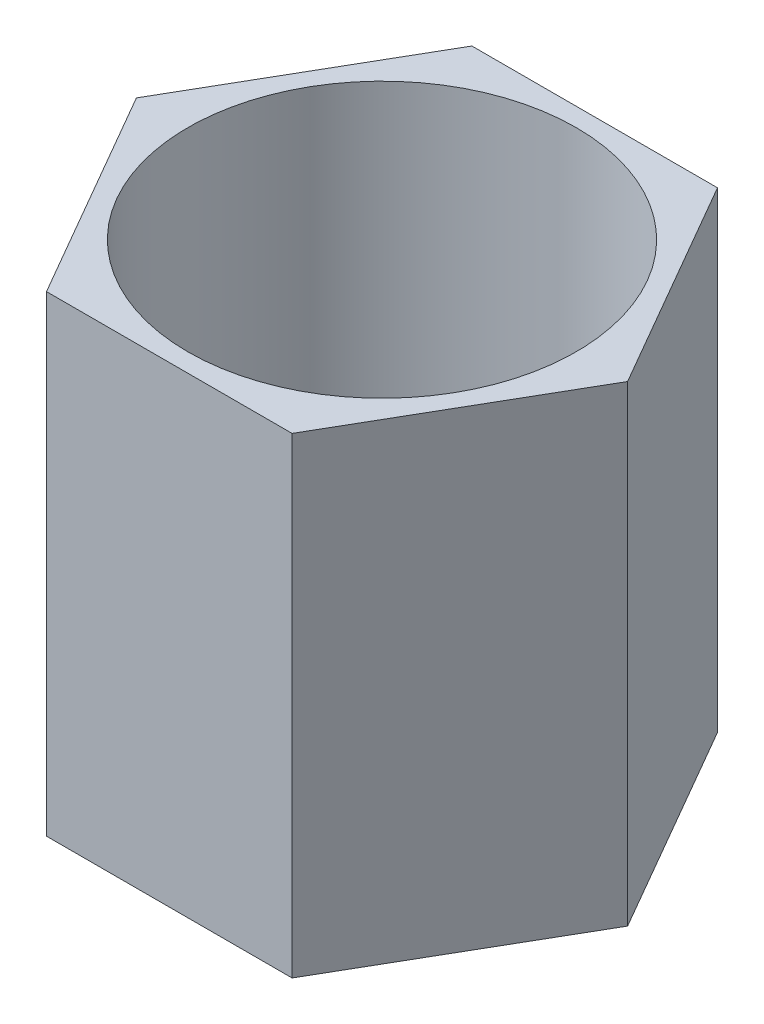
ISO-10303-21;
HEADER;
FILE_DESCRIPTION(('STEP AP214'),'2;1');
FILE_NAME('part.step','',(''),(''),'','','');
FILE_SCHEMA(('AUTOMOTIVE_DESIGN { 1 0 10303 214 1 1 1 1 }'));
ENDSEC;
DATA;
#1=APPLICATION_CONTEXT('core data for automotive mechanical design processes');
#2=APPLICATION_PROTOCOL_DEFINITION('international standard','automotive_design',2000,#1);
#3=PRODUCT_CONTEXT('',#1,'mechanical');
#4=PRODUCT('Part','Part','',(#3));
#5=PRODUCT_RELATED_PRODUCT_CATEGORY('part','',(#4));
#6=PRODUCT_DEFINITION_FORMATION('','',#4);
#7=PRODUCT_DEFINITION_CONTEXT('part definition',#1,'design');
#8=PRODUCT_DEFINITION('design','',#6,#7);
#9=PRODUCT_DEFINITION_SHAPE('','',#8);
#10=(LENGTH_UNIT() NAMED_UNIT(*) SI_UNIT(.MILLI.,.METRE.));
#11=(NAMED_UNIT(*) PLANE_ANGLE_UNIT() SI_UNIT($,.RADIAN.));
#12=(NAMED_UNIT(*) SI_UNIT($,.STERADIAN.) SOLID_ANGLE_UNIT());
#13=UNCERTAINTY_MEASURE_WITH_UNIT(LENGTH_MEASURE(1.E-05),#10,'distance_accuracy_value','');
#14=(GEOMETRIC_REPRESENTATION_CONTEXT(3) GLOBAL_UNCERTAINTY_ASSIGNED_CONTEXT((#13)) GLOBAL_UNIT_ASSIGNED_CONTEXT((#10,
#11,#12)) REPRESENTATION_CONTEXT('',''));
#15=CARTESIAN_POINT('',(0.,0.,0.));
#16=DIRECTION('',(0.,0.,1.));
#17=DIRECTION('',(1.,0.,0.));
#18=AXIS2_PLACEMENT_3D('',#15,#16,#17);
#19=CARTESIAN_POINT('',(0.,5.1,0.));
#20=DIRECTION('',(0.,1.,0.));
#21=DIRECTION('',(0.,0.,1.));
#22=AXIS2_PLACEMENT_3D('',#19,#20,#21);
#23=PLANE('',#22);
#24=CARTESIAN_POINT('',(0.,5.1,0.));
#25=DIRECTION('',(0.,1.,0.));
#26=DIRECTION('',(0.,0.,1.));
#27=AXIS2_PLACEMENT_3D('',#24,#25,#26);
#28=CIRCLE('',#27,2.1);
#29=CARTESIAN_POINT('',(0.,5.1,2.1));
#30=VERTEX_POINT('',#29);
#31=EDGE_CURVE('E162',#30,#30,#28,.T.);
#32=ORIENTED_EDGE('',*,*,#31,.F.);
#33=EDGE_LOOP('',(#32));
#34=FACE_BOUND('',#33,.T.);
#35=DIRECTION('',(0.5,0.,-0.866025403784439));
#36=VECTOR('',#35,1.);
#37=CARTESIAN_POINT('',(1.32790561913614,5.1,2.3));
#38=LINE('',#37,#36);
#39=CARTESIAN_POINT('',(1.32790561913614,5.1,2.3));
#40=VERTEX_POINT('',#39);
#41=CARTESIAN_POINT('',(2.65581123827228,5.1,0.));
#42=VERTEX_POINT('',#41);
#43=EDGE_CURVE('E146',#40,#42,#38,.T.);
#44=ORIENTED_EDGE('',*,*,#43,.T.);
#45=DIRECTION('',(-0.5,0.,-0.866025403784438));
#46=VECTOR('',#45,1.);
#47=CARTESIAN_POINT('',(2.65581123827228,5.1,0.));
#48=LINE('',#47,#46);
#49=CARTESIAN_POINT('',(1.32790561913614,5.1,-2.3));
#50=VERTEX_POINT('',#49);
#51=EDGE_CURVE('E140',#42,#50,#48,.T.);
#52=ORIENTED_EDGE('',*,*,#51,.T.);
#53=DIRECTION('',(-1.,0.,0.));
#54=VECTOR('',#53,1.);
#55=CARTESIAN_POINT('',(1.32790561913614,5.1,-2.3));
#56=LINE('',#55,#54);
#57=CARTESIAN_POINT('',(-1.32790561913614,5.1,-2.3));
#58=VERTEX_POINT('',#57);
#59=EDGE_CURVE('E135',#50,#58,#56,.T.);
#60=ORIENTED_EDGE('',*,*,#59,.T.);
#61=DIRECTION('',(-0.5,0.,0.866025403784439));
#62=VECTOR('',#61,1.);
#63=CARTESIAN_POINT('',(-1.32790561913614,5.1,-2.3));
#64=LINE('',#63,#62);
#65=CARTESIAN_POINT('',(-2.65581123827228,5.1,0.));
#66=VERTEX_POINT('',#65);
#67=EDGE_CURVE('E68',#58,#66,#64,.T.);
#68=ORIENTED_EDGE('',*,*,#67,.T.);
#69=DIRECTION('',(0.5,0.,0.866025403784439));
#70=VECTOR('',#69,1.);
#71=CARTESIAN_POINT('',(-2.65581123827228,5.1,0.));
#72=LINE('',#71,#70);
#73=CARTESIAN_POINT('',(-1.32790561913614,5.1,2.3));
#74=VERTEX_POINT('',#73);
#75=EDGE_CURVE('E123',#66,#74,#72,.T.);
#76=ORIENTED_EDGE('',*,*,#75,.T.);
#77=DIRECTION('',(1.,0.,0.));
#78=VECTOR('',#77,1.);
#79=CARTESIAN_POINT('',(-1.32790561913614,5.1,2.3));
#80=LINE('',#79,#78);
#81=EDGE_CURVE('E130',#74,#40,#80,.T.);
#82=ORIENTED_EDGE('',*,*,#81,.T.);
#83=EDGE_LOOP('',(#44,#52,#60,#68,#76,#82));
#84=FACE_BOUND('',#83,.T.);
#85=ADVANCED_FACE('F49',(#34,#84),#23,.T.);
#86=CARTESIAN_POINT('',(0.,0.,0.));
#87=DIRECTION('',(0.,1.,0.));
#88=DIRECTION('',(0.,0.,1.));
#89=AXIS2_PLACEMENT_3D('',#86,#87,#88);
#90=PLANE('',#89);
#91=CARTESIAN_POINT('',(0.,0.,0.));
#92=DIRECTION('',(0.,1.,0.));
#93=DIRECTION('',(0.,0.,1.));
#94=AXIS2_PLACEMENT_3D('',#91,#92,#93);
#95=CIRCLE('',#94,2.1);
#96=CARTESIAN_POINT('',(0.,0.,2.1));
#97=VERTEX_POINT('',#96);
#98=EDGE_CURVE('E152',#97,#97,#95,.T.);
#99=ORIENTED_EDGE('',*,*,#98,.T.);
#100=EDGE_LOOP('',(#99));
#101=FACE_BOUND('',#100,.T.);
#102=DIRECTION('',(-0.5,0.,-0.866025403784438));
#103=VECTOR('',#102,1.);
#104=CARTESIAN_POINT('',(1.99185842870421,0.,-1.15));
#105=LINE('',#104,#103);
#106=CARTESIAN_POINT('',(2.65581123827228,0.,0.));
#107=VERTEX_POINT('',#106);
#108=CARTESIAN_POINT('',(1.32790561913614,0.,-2.3));
#109=VERTEX_POINT('',#108);
#110=EDGE_CURVE('E11',#107,#109,#105,.T.);
#111=ORIENTED_EDGE('',*,*,#110,.F.);
#112=DIRECTION('',(0.5,0.,-0.866025403784439));
#113=VECTOR('',#112,1.);
#114=CARTESIAN_POINT('',(1.99185842870421,0.,1.15));
#115=LINE('',#114,#113);
#116=CARTESIAN_POINT('',(1.32790561913614,0.,2.3));
#117=VERTEX_POINT('',#116);
#118=EDGE_CURVE('E58',#117,#107,#115,.T.);
#119=ORIENTED_EDGE('',*,*,#118,.F.);
#120=DIRECTION('',(1.,0.,0.));
#121=VECTOR('',#120,1.);
#122=CARTESIAN_POINT('',(0.,0.,2.3));
#123=LINE('',#122,#121);
#124=CARTESIAN_POINT('',(-1.32790561913614,0.,2.3));
#125=VERTEX_POINT('',#124);
#126=EDGE_CURVE('E176',#125,#117,#123,.T.);
#127=ORIENTED_EDGE('',*,*,#126,.F.);
#128=DIRECTION('',(0.5,0.,0.866025403784439));
#129=VECTOR('',#128,1.);
#130=CARTESIAN_POINT('',(-1.99185842870421,0.,1.15));
#131=LINE('',#130,#129);
#132=CARTESIAN_POINT('',(-2.65581123827228,0.,0.));
#133=VERTEX_POINT('',#132);
#134=EDGE_CURVE('E174',#133,#125,#131,.T.);
#135=ORIENTED_EDGE('',*,*,#134,.F.);
#136=DIRECTION('',(-0.5,0.,0.866025403784439));
#137=VECTOR('',#136,1.);
#138=CARTESIAN_POINT('',(-1.99185842870421,0.,-1.15));
#139=LINE('',#138,#137);
#140=CARTESIAN_POINT('',(-1.32790561913614,0.,-2.3));
#141=VERTEX_POINT('',#140);
#142=EDGE_CURVE('E115',#141,#133,#139,.T.);
#143=ORIENTED_EDGE('',*,*,#142,.F.);
#144=DIRECTION('',(-1.,0.,0.));
#145=VECTOR('',#144,1.);
#146=CARTESIAN_POINT('',(0.,0.,-2.3));
#147=LINE('',#146,#145);
#148=EDGE_CURVE('E166',#109,#141,#147,.T.);
#149=ORIENTED_EDGE('',*,*,#148,.F.);
#150=EDGE_LOOP('',(#111,#119,#127,#135,#143,#149));
#151=FACE_BOUND('',#150,.T.);
#152=ADVANCED_FACE('F51',(#101,#151),#90,.F.);
#153=CARTESIAN_POINT('',(0.,5.1,0.));
#154=DIRECTION('',(0.,-1.,0.));
#155=DIRECTION('',(0.,0.,-1.));
#156=AXIS2_PLACEMENT_3D('',#153,#154,#155);
#157=CYLINDRICAL_SURFACE('',#156,2.1);
#158=ORIENTED_EDGE('',*,*,#31,.T.);
#159=EDGE_LOOP('',(#158));
#160=FACE_BOUND('',#159,.T.);
#161=ORIENTED_EDGE('',*,*,#98,.F.);
#162=EDGE_LOOP('',(#161));
#163=FACE_BOUND('',#162,.T.);
#164=ADVANCED_FACE('F208',(#160,#163),#157,.F.);
#165=CARTESIAN_POINT('',(2.65581123827228,-4.9,0.));
#166=DIRECTION('',(0.866025403784438,0.,-0.5));
#167=DIRECTION('',(-0.5,0.,-0.866025403784438));
#168=AXIS2_PLACEMENT_3D('',#165,#166,#167);
#169=PLANE('',#168);
#170=ORIENTED_EDGE('',*,*,#110,.T.);
#171=DIRECTION('',(0.,1.,0.));
#172=VECTOR('',#171,1.);
#173=CARTESIAN_POINT('',(1.32790561913614,-4.9,-2.3));
#174=LINE('',#173,#172);
#175=EDGE_CURVE('E77',#109,#50,#174,.T.);
#176=ORIENTED_EDGE('',*,*,#175,.T.);
#177=ORIENTED_EDGE('',*,*,#51,.F.);
#178=DIRECTION('',(0.,1.,0.));
#179=VECTOR('',#178,1.);
#180=CARTESIAN_POINT('',(2.65581123827228,-4.9,0.));
#181=LINE('',#180,#179);
#182=EDGE_CURVE('E149',#107,#42,#181,.T.);
#183=ORIENTED_EDGE('',*,*,#182,.F.);
#184=EDGE_LOOP('',(#170,#176,#177,#183));
#185=FACE_BOUND('',#184,.T.);
#186=ADVANCED_FACE('F189',(#185),#169,.T.);
#187=CARTESIAN_POINT('',(1.32790561913614,-4.9,2.3));
#188=DIRECTION('',(0.866025403784439,0.,0.5));
#189=DIRECTION('',(0.5,0.,-0.866025403784439));
#190=AXIS2_PLACEMENT_3D('',#187,#188,#189);
#191=PLANE('',#190);
#192=ORIENTED_EDGE('',*,*,#118,.T.);
#193=ORIENTED_EDGE('',*,*,#182,.T.);
#194=ORIENTED_EDGE('',*,*,#43,.F.);
#195=DIRECTION('',(0.,1.,0.));
#196=VECTOR('',#195,1.);
#197=CARTESIAN_POINT('',(1.32790561913614,-4.9,2.3));
#198=LINE('',#197,#196);
#199=EDGE_CURVE('E153',#117,#40,#198,.T.);
#200=ORIENTED_EDGE('',*,*,#199,.F.);
#201=EDGE_LOOP('',(#192,#193,#194,#200));
#202=FACE_BOUND('',#201,.T.);
#203=ADVANCED_FACE('F182',(#202),#191,.T.);
#204=CARTESIAN_POINT('',(-1.32790561913614,-4.9,2.3));
#205=DIRECTION('',(0.,0.,1.));
#206=DIRECTION('',(1.,0.,0.));
#207=AXIS2_PLACEMENT_3D('',#204,#205,#206);
#208=PLANE('',#207);
#209=ORIENTED_EDGE('',*,*,#126,.T.);
#210=ORIENTED_EDGE('',*,*,#199,.T.);
#211=ORIENTED_EDGE('',*,*,#81,.F.);
#212=DIRECTION('',(0.,1.,0.));
#213=VECTOR('',#212,1.);
#214=CARTESIAN_POINT('',(-1.32790561913614,-4.9,2.3));
#215=LINE('',#214,#213);
#216=EDGE_CURVE('E119',#125,#74,#215,.T.);
#217=ORIENTED_EDGE('',*,*,#216,.F.);
#218=EDGE_LOOP('',(#209,#210,#211,#217));
#219=FACE_BOUND('',#218,.T.);
#220=ADVANCED_FACE('F194',(#219),#208,.T.);
#221=CARTESIAN_POINT('',(-2.65581123827228,-4.9,0.));
#222=DIRECTION('',(-0.866025403784439,0.,0.5));
#223=DIRECTION('',(0.5,0.,0.866025403784439));
#224=AXIS2_PLACEMENT_3D('',#221,#222,#223);
#225=PLANE('',#224);
#226=ORIENTED_EDGE('',*,*,#134,.T.);
#227=ORIENTED_EDGE('',*,*,#216,.T.);
#228=ORIENTED_EDGE('',*,*,#75,.F.);
#229=DIRECTION('',(0.,1.,0.));
#230=VECTOR('',#229,1.);
#231=CARTESIAN_POINT('',(-2.65581123827228,-4.9,0.));
#232=LINE('',#231,#230);
#233=EDGE_CURVE('E111',#133,#66,#232,.T.);
#234=ORIENTED_EDGE('',*,*,#233,.F.);
#235=EDGE_LOOP('',(#226,#227,#228,#234));
#236=FACE_BOUND('',#235,.T.);
#237=ADVANCED_FACE('F124',(#236),#225,.T.);
#238=CARTESIAN_POINT('',(-1.32790561913614,-4.9,-2.3));
#239=DIRECTION('',(-0.866025403784439,0.,-0.5));
#240=DIRECTION('',(-0.5,0.,0.866025403784439));
#241=AXIS2_PLACEMENT_3D('',#238,#239,#240);
#242=PLANE('',#241);
#243=ORIENTED_EDGE('',*,*,#142,.T.);
#244=ORIENTED_EDGE('',*,*,#233,.T.);
#245=ORIENTED_EDGE('',*,*,#67,.F.);
#246=DIRECTION('',(0.,1.,0.));
#247=VECTOR('',#246,1.);
#248=CARTESIAN_POINT('',(-1.32790561913614,-4.9,-2.3));
#249=LINE('',#248,#247);
#250=EDGE_CURVE('E120',#141,#58,#249,.T.);
#251=ORIENTED_EDGE('',*,*,#250,.F.);
#252=EDGE_LOOP('',(#243,#244,#245,#251));
#253=FACE_BOUND('',#252,.T.);
#254=ADVANCED_FACE('F113',(#253),#242,.T.);
#255=CARTESIAN_POINT('',(1.32790561913614,-4.9,-2.3));
#256=DIRECTION('',(0.,0.,-1.));
#257=DIRECTION('',(-1.,0.,0.));
#258=AXIS2_PLACEMENT_3D('',#255,#256,#257);
#259=PLANE('',#258);
#260=ORIENTED_EDGE('',*,*,#148,.T.);
#261=ORIENTED_EDGE('',*,*,#250,.T.);
#262=ORIENTED_EDGE('',*,*,#59,.F.);
#263=ORIENTED_EDGE('',*,*,#175,.F.);
#264=EDGE_LOOP('',(#260,#261,#262,#263));
#265=FACE_BOUND('',#264,.T.);
#266=ADVANCED_FACE('F191',(#265),#259,.T.);
#267=CLOSED_SHELL('',(#85,#152,#164,#186,#203,#220,#237,#254,#266));
#268=MANIFOLD_SOLID_BREP('B2',#267);
#269=ADVANCED_BREP_SHAPE_REPRESENTATION('',(#18,#268),#14);
#270=SHAPE_DEFINITION_REPRESENTATION(#9,#269);
ENDSEC;
END-ISO-10303-21;
